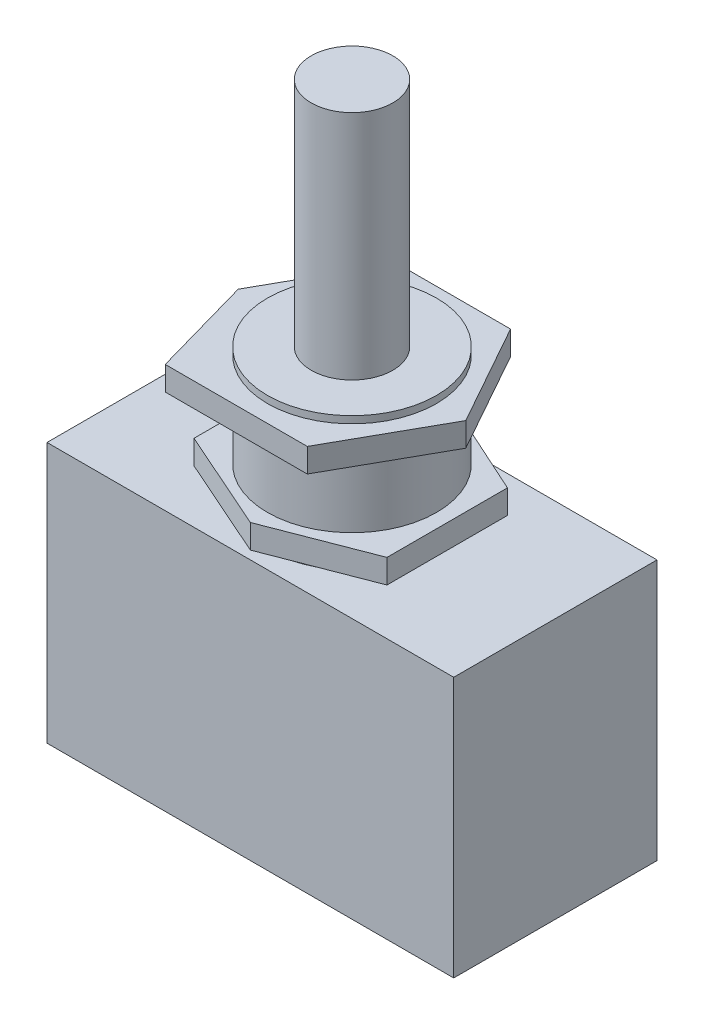
ISO-10303-21;
HEADER;
FILE_DESCRIPTION(('STEP AP214'),'2;1');
FILE_NAME('part.step','',(''),(''),'','','');
FILE_SCHEMA(('AUTOMOTIVE_DESIGN { 1 0 10303 214 1 1 1 1 }'));
ENDSEC;
DATA;
#1=APPLICATION_CONTEXT('core data for automotive mechanical design processes');
#2=APPLICATION_PROTOCOL_DEFINITION('international standard','automotive_design',2000,#1);
#3=PRODUCT_CONTEXT('',#1,'mechanical');
#4=PRODUCT('Part','Part','',(#3));
#5=PRODUCT_RELATED_PRODUCT_CATEGORY('part','',(#4));
#6=PRODUCT_DEFINITION_FORMATION('','',#4);
#7=PRODUCT_DEFINITION_CONTEXT('part definition',#1,'design');
#8=PRODUCT_DEFINITION('design','',#6,#7);
#9=PRODUCT_DEFINITION_SHAPE('','',#8);
#10=(LENGTH_UNIT() NAMED_UNIT(*) SI_UNIT(.MILLI.,.METRE.));
#11=(NAMED_UNIT(*) PLANE_ANGLE_UNIT() SI_UNIT($,.RADIAN.));
#12=(NAMED_UNIT(*) SI_UNIT($,.STERADIAN.) SOLID_ANGLE_UNIT());
#13=UNCERTAINTY_MEASURE_WITH_UNIT(LENGTH_MEASURE(1.E-05),#10,'distance_accuracy_value','');
#14=(GEOMETRIC_REPRESENTATION_CONTEXT(3) GLOBAL_UNCERTAINTY_ASSIGNED_CONTEXT((#13)) GLOBAL_UNIT_ASSIGNED_CONTEXT((#10,
#11,#12)) REPRESENTATION_CONTEXT('',''));
#15=CARTESIAN_POINT('',(0.,0.,0.));
#16=DIRECTION('',(0.,0.,1.));
#17=DIRECTION('',(1.,0.,0.));
#18=AXIS2_PLACEMENT_3D('',#15,#16,#17);
#19=CARTESIAN_POINT('',(0.,18.75,0.));
#20=DIRECTION('',(0.,-1.,0.));
#21=DIRECTION('',(0.,0.,-1.));
#22=AXIS2_PLACEMENT_3D('',#19,#20,#21);
#23=CYLINDRICAL_SURFACE('',#22,6.);
#24=CARTESIAN_POINT('',(0.,11.55,0.));
#25=DIRECTION('',(0.,1.,0.));
#26=DIRECTION('',(0.,0.,1.));
#27=AXIS2_PLACEMENT_3D('',#24,#25,#26);
#28=CIRCLE('',#27,6.);
#29=CARTESIAN_POINT('',(0.,11.55,6.));
#30=VERTEX_POINT('',#29);
#31=EDGE_CURVE('E409',#30,#30,#28,.T.);
#32=ORIENTED_EDGE('',*,*,#31,.T.);
#33=EDGE_LOOP('',(#32));
#34=FACE_BOUND('',#33,.T.);
#35=CARTESIAN_POINT('',(0.,16.55,0.));
#36=DIRECTION('',(0.,1.,0.));
#37=DIRECTION('',(0.,0.,1.));
#38=AXIS2_PLACEMENT_3D('',#35,#36,#37);
#39=CIRCLE('',#38,6.);
#40=CARTESIAN_POINT('',(0.,16.55,6.));
#41=VERTEX_POINT('',#40);
#42=EDGE_CURVE('E284',#41,#41,#39,.T.);
#43=ORIENTED_EDGE('',*,*,#42,.F.);
#44=EDGE_LOOP('',(#43));
#45=FACE_BOUND('',#44,.T.);
#46=ADVANCED_FACE('F45',(#34,#45),#23,.T.);
#47=CARTESIAN_POINT('',(0.,9.25,0.));
#48=DIRECTION('',(0.,1.,0.));
#49=DIRECTION('',(0.,0.,1.));
#50=AXIS2_PLACEMENT_3D('',#47,#48,#49);
#51=CIRCLE('',#50,6.);
#52=CARTESIAN_POINT('',(0.,9.25,6.));
#53=VERTEX_POINT('',#52);
#54=EDGE_CURVE('E415',#53,#53,#51,.T.);
#55=ORIENTED_EDGE('',*,*,#54,.T.);
#56=EDGE_LOOP('',(#55));
#57=FACE_BOUND('',#56,.T.);
#58=CARTESIAN_POINT('',(0.,9.85,0.));
#59=DIRECTION('',(0.,1.,0.));
#60=DIRECTION('',(0.,0.,1.));
#61=AXIS2_PLACEMENT_3D('',#58,#59,#60);
#62=CIRCLE('',#61,6.);
#63=CARTESIAN_POINT('',(0.,9.85,6.));
#64=VERTEX_POINT('',#63);
#65=EDGE_CURVE('E419',#64,#64,#62,.T.);
#66=ORIENTED_EDGE('',*,*,#65,.F.);
#67=EDGE_LOOP('',(#66));
#68=FACE_BOUND('',#67,.T.);
#69=ADVANCED_FACE('F511',(#57,#68),#23,.T.);
#70=CARTESIAN_POINT('',(14.445,-9.25,7.22));
#71=DIRECTION('',(-1.,0.,0.));
#72=DIRECTION('',(0.,0.,1.));
#73=AXIS2_PLACEMENT_3D('',#70,#71,#72);
#74=PLANE('',#73);
#75=DIRECTION('',(0.,1.,0.));
#76=VECTOR('',#75,1.);
#77=CARTESIAN_POINT('',(14.445,-9.25,-7.22));
#78=LINE('',#77,#76);
#79=CARTESIAN_POINT('',(14.445,-9.25,-7.22));
#80=VERTEX_POINT('',#79);
#81=CARTESIAN_POINT('',(14.445,9.25,-7.22));
#82=VERTEX_POINT('',#81);
#83=EDGE_CURVE('E414',#80,#82,#78,.T.);
#84=ORIENTED_EDGE('',*,*,#83,.T.);
#85=DIRECTION('',(0.,0.,-1.));
#86=VECTOR('',#85,1.);
#87=CARTESIAN_POINT('',(14.445,9.25,7.22));
#88=LINE('',#87,#86);
#89=CARTESIAN_POINT('',(14.445,9.25,7.22));
#90=VERTEX_POINT('',#89);
#91=EDGE_CURVE('E420',#90,#82,#88,.T.);
#92=ORIENTED_EDGE('',*,*,#91,.F.);
#93=DIRECTION('',(0.,1.,0.));
#94=VECTOR('',#93,1.);
#95=CARTESIAN_POINT('',(14.445,-9.25,7.22));
#96=LINE('',#95,#94);
#97=CARTESIAN_POINT('',(14.445,-9.25,7.22));
#98=VERTEX_POINT('',#97);
#99=EDGE_CURVE('E421',#98,#90,#96,.T.);
#100=ORIENTED_EDGE('',*,*,#99,.F.);
#101=DIRECTION('',(0.,0.,-1.));
#102=VECTOR('',#101,1.);
#103=CARTESIAN_POINT('',(14.445,-9.25,7.22));
#104=LINE('',#103,#102);
#105=EDGE_CURVE('E435',#98,#80,#104,.T.);
#106=ORIENTED_EDGE('',*,*,#105,.T.);
#107=EDGE_LOOP('',(#84,#92,#100,#106));
#108=FACE_BOUND('',#107,.T.);
#109=ADVANCED_FACE('F47',(#108),#74,.F.);
#110=CARTESIAN_POINT('',(-14.445,9.25,7.22));
#111=DIRECTION('',(0.,-1.,0.));
#112=DIRECTION('',(0.,0.,-1.));
#113=AXIS2_PLACEMENT_3D('',#110,#111,#112);
#114=PLANE('',#113);
#115=ORIENTED_EDGE('',*,*,#54,.F.);
#116=EDGE_LOOP('',(#115));
#117=FACE_BOUND('',#116,.T.);
#118=DIRECTION('',(-1.,0.,0.));
#119=VECTOR('',#118,1.);
#120=CARTESIAN_POINT('',(-14.445,9.25,-7.22));
#121=LINE('',#120,#119);
#122=CARTESIAN_POINT('',(-14.445,9.25,-7.22));
#123=VERTEX_POINT('',#122);
#124=EDGE_CURVE('E439',#82,#123,#121,.T.);
#125=ORIENTED_EDGE('',*,*,#124,.T.);
#126=DIRECTION('',(0.,0.,-1.));
#127=VECTOR('',#126,1.);
#128=CARTESIAN_POINT('',(-14.445,9.25,7.22));
#129=LINE('',#128,#127);
#130=CARTESIAN_POINT('',(-14.445,9.25,7.22));
#131=VERTEX_POINT('',#130);
#132=EDGE_CURVE('E454',#131,#123,#129,.T.);
#133=ORIENTED_EDGE('',*,*,#132,.F.);
#134=DIRECTION('',(-1.,0.,0.));
#135=VECTOR('',#134,1.);
#136=CARTESIAN_POINT('',(-14.445,9.25,7.22));
#137=LINE('',#136,#135);
#138=EDGE_CURVE('E425',#90,#131,#137,.T.);
#139=ORIENTED_EDGE('',*,*,#138,.F.);
#140=ORIENTED_EDGE('',*,*,#91,.T.);
#141=EDGE_LOOP('',(#125,#133,#139,#140));
#142=FACE_BOUND('',#141,.T.);
#143=ADVANCED_FACE('F658',(#117,#142),#114,.F.);
#144=CARTESIAN_POINT('',(-14.445,-9.25,7.22));
#145=DIRECTION('',(1.,0.,0.));
#146=DIRECTION('',(0.,0.,-1.));
#147=AXIS2_PLACEMENT_3D('',#144,#145,#146);
#148=PLANE('',#147);
#149=DIRECTION('',(0.,-1.,0.));
#150=VECTOR('',#149,1.);
#151=CARTESIAN_POINT('',(-14.445,-9.25,-7.22));
#152=LINE('',#151,#150);
#153=CARTESIAN_POINT('',(-14.445,-9.25,-7.22));
#154=VERTEX_POINT('',#153);
#155=EDGE_CURVE('E442',#123,#154,#152,.T.);
#156=ORIENTED_EDGE('',*,*,#155,.T.);
#157=DIRECTION('',(0.,0.,-1.));
#158=VECTOR('',#157,1.);
#159=CARTESIAN_POINT('',(-14.445,-9.25,7.22));
#160=LINE('',#159,#158);
#161=CARTESIAN_POINT('',(-14.445,-9.25,7.22));
#162=VERTEX_POINT('',#161);
#163=EDGE_CURVE('E450',#162,#154,#160,.T.);
#164=ORIENTED_EDGE('',*,*,#163,.F.);
#165=DIRECTION('',(0.,-1.,0.));
#166=VECTOR('',#165,1.);
#167=CARTESIAN_POINT('',(-14.445,-9.25,7.22));
#168=LINE('',#167,#166);
#169=EDGE_CURVE('E429',#131,#162,#168,.T.);
#170=ORIENTED_EDGE('',*,*,#169,.F.);
#171=ORIENTED_EDGE('',*,*,#132,.T.);
#172=EDGE_LOOP('',(#156,#164,#170,#171));
#173=FACE_BOUND('',#172,.T.);
#174=ADVANCED_FACE('F656',(#173),#148,.F.);
#175=CARTESIAN_POINT('',(-14.445,-9.25,7.22));
#176=DIRECTION('',(0.,1.,0.));
#177=DIRECTION('',(0.,0.,1.));
#178=AXIS2_PLACEMENT_3D('',#175,#176,#177);
#179=PLANE('',#178);
#180=DIRECTION('',(1.,0.,0.));
#181=VECTOR('',#180,1.);
#182=CARTESIAN_POINT('',(-14.445,-9.25,3.1));
#183=LINE('',#182,#181);
#184=CARTESIAN_POINT('',(-8.8,-9.25,3.1));
#185=VERTEX_POINT('',#184);
#186=CARTESIAN_POINT('',(-7.2,-9.25,3.1));
#187=VERTEX_POINT('',#186);
#188=EDGE_CURVE('E54',#185,#187,#183,.T.);
#189=ORIENTED_EDGE('',*,*,#188,.T.);
#190=DIRECTION('',(0.,0.,-1.));
#191=VECTOR('',#190,1.);
#192=CARTESIAN_POINT('',(-7.2,-9.25,7.22));
#193=LINE('',#192,#191);
#194=CARTESIAN_POINT('',(-7.2,-9.25,-3.1));
#195=VERTEX_POINT('',#194);
#196=EDGE_CURVE('E11',#187,#195,#193,.T.);
#197=ORIENTED_EDGE('',*,*,#196,.T.);
#198=DIRECTION('',(-1.,0.,0.));
#199=VECTOR('',#198,1.);
#200=CARTESIAN_POINT('',(-14.445,-9.25,-3.1));
#201=LINE('',#200,#199);
#202=CARTESIAN_POINT('',(-8.8,-9.25,-3.1));
#203=VERTEX_POINT('',#202);
#204=EDGE_CURVE('E210',#195,#203,#201,.T.);
#205=ORIENTED_EDGE('',*,*,#204,.T.);
#206=DIRECTION('',(0.,0.,1.));
#207=VECTOR('',#206,1.);
#208=CARTESIAN_POINT('',(-8.8,-9.25,7.22));
#209=LINE('',#208,#207);
#210=EDGE_CURVE('E490',#203,#185,#209,.T.);
#211=ORIENTED_EDGE('',*,*,#210,.T.);
#212=EDGE_LOOP('',(#189,#197,#205,#211));
#213=FACE_BOUND('',#212,.T.);
#214=DIRECTION('',(1.,0.,0.));
#215=VECTOR('',#214,1.);
#216=CARTESIAN_POINT('',(-14.445,-9.25,3.1));
#217=LINE('',#216,#215);
#218=CARTESIAN_POINT('',(7.2,-9.25,3.1));
#219=VERTEX_POINT('',#218);
#220=CARTESIAN_POINT('',(8.8,-9.25,3.1));
#221=VERTEX_POINT('',#220);
#222=EDGE_CURVE('E480',#219,#221,#217,.T.);
#223=ORIENTED_EDGE('',*,*,#222,.T.);
#224=DIRECTION('',(0.,0.,-1.));
#225=VECTOR('',#224,1.);
#226=CARTESIAN_POINT('',(8.8,-9.25,7.22));
#227=LINE('',#226,#225);
#228=CARTESIAN_POINT('',(8.8,-9.25,-3.1));
#229=VERTEX_POINT('',#228);
#230=EDGE_CURVE('E484',#221,#229,#227,.T.);
#231=ORIENTED_EDGE('',*,*,#230,.T.);
#232=DIRECTION('',(-1.,0.,0.));
#233=VECTOR('',#232,1.);
#234=CARTESIAN_POINT('',(-14.445,-9.25,-3.1));
#235=LINE('',#234,#233);
#236=CARTESIAN_POINT('',(7.2,-9.25,-3.1));
#237=VERTEX_POINT('',#236);
#238=EDGE_CURVE('E283',#229,#237,#235,.T.);
#239=ORIENTED_EDGE('',*,*,#238,.T.);
#240=DIRECTION('',(0.,0.,1.));
#241=VECTOR('',#240,1.);
#242=CARTESIAN_POINT('',(7.2,-9.25,7.22));
#243=LINE('',#242,#241);
#244=EDGE_CURVE('E476',#237,#219,#243,.T.);
#245=ORIENTED_EDGE('',*,*,#244,.T.);
#246=EDGE_LOOP('',(#223,#231,#239,#245));
#247=FACE_BOUND('',#246,.T.);
#248=DIRECTION('',(1.,0.,0.));
#249=VECTOR('',#248,1.);
#250=CARTESIAN_POINT('',(-14.445,-9.25,-7.22));
#251=LINE('',#250,#249);
#252=EDGE_CURVE('E426',#154,#80,#251,.T.);
#253=ORIENTED_EDGE('',*,*,#252,.T.);
#254=ORIENTED_EDGE('',*,*,#105,.F.);
#255=DIRECTION('',(1.,0.,0.));
#256=VECTOR('',#255,1.);
#257=CARTESIAN_POINT('',(-14.445,-9.25,7.22));
#258=LINE('',#257,#256);
#259=EDGE_CURVE('E432',#162,#98,#258,.T.);
#260=ORIENTED_EDGE('',*,*,#259,.F.);
#261=ORIENTED_EDGE('',*,*,#163,.T.);
#262=EDGE_LOOP('',(#253,#254,#260,#261));
#263=FACE_BOUND('',#262,.T.);
#264=ADVANCED_FACE('F496',(#213,#247,#263),#179,.F.);
#265=CARTESIAN_POINT('',(0.,0.,7.22));
#266=DIRECTION('',(0.,0.,-1.));
#267=DIRECTION('',(-1.,0.,0.));
#268=AXIS2_PLACEMENT_3D('',#265,#266,#267);
#269=PLANE('',#268);
#270=ORIENTED_EDGE('',*,*,#99,.T.);
#271=ORIENTED_EDGE('',*,*,#138,.T.);
#272=ORIENTED_EDGE('',*,*,#169,.T.);
#273=ORIENTED_EDGE('',*,*,#259,.T.);
#274=EDGE_LOOP('',(#270,#271,#272,#273));
#275=FACE_BOUND('',#274,.T.);
#276=ADVANCED_FACE('F626',(#275),#269,.F.);
#277=CARTESIAN_POINT('',(0.,0.,-7.22));
#278=DIRECTION('',(0.,0.,-1.));
#279=DIRECTION('',(-1.,0.,0.));
#280=AXIS2_PLACEMENT_3D('',#277,#278,#279);
#281=PLANE('',#280);
#282=ORIENTED_EDGE('',*,*,#83,.F.);
#283=ORIENTED_EDGE('',*,*,#252,.F.);
#284=ORIENTED_EDGE('',*,*,#155,.F.);
#285=ORIENTED_EDGE('',*,*,#124,.F.);
#286=EDGE_LOOP('',(#282,#283,#284,#285));
#287=FACE_BOUND('',#286,.T.);
#288=ADVANCED_FACE('F621',(#287),#281,.T.);
#289=CARTESIAN_POINT('',(7.,11.55,4.51543450408666));
#290=DIRECTION('',(-1.,0.,0.));
#291=DIRECTION('',(0.,0.,1.));
#292=AXIS2_PLACEMENT_3D('',#289,#290,#291);
#293=PLANE('',#292);
#294=DIRECTION('',(0.,0.,-1.));
#295=VECTOR('',#294,1.);
#296=CARTESIAN_POINT('',(7.,9.85,4.51543450408666));
#297=LINE('',#296,#295);
#298=CARTESIAN_POINT('',(7.,9.85,4.51543450408666));
#299=VERTEX_POINT('',#298);
#300=CARTESIAN_POINT('',(7.,9.85,-4.0415));
#301=VERTEX_POINT('',#300);
#302=EDGE_CURVE('E368',#299,#301,#297,.T.);
#303=ORIENTED_EDGE('',*,*,#302,.T.);
#304=DIRECTION('',(0.,-1.,0.));
#305=VECTOR('',#304,1.);
#306=CARTESIAN_POINT('',(7.,11.55,-4.0415));
#307=LINE('',#306,#305);
#308=CARTESIAN_POINT('',(7.,11.55,-4.0415));
#309=VERTEX_POINT('',#308);
#310=EDGE_CURVE('E405',#309,#301,#307,.T.);
#311=ORIENTED_EDGE('',*,*,#310,.F.);
#312=DIRECTION('',(0.,0.,-1.));
#313=VECTOR('',#312,1.);
#314=CARTESIAN_POINT('',(7.,11.55,4.51543450408666));
#315=LINE('',#314,#313);
#316=CARTESIAN_POINT('',(7.,11.55,4.51543450408666));
#317=VERTEX_POINT('',#316);
#318=EDGE_CURVE('E347',#317,#309,#315,.T.);
#319=ORIENTED_EDGE('',*,*,#318,.F.);
#320=DIRECTION('',(0.,-1.,0.));
#321=VECTOR('',#320,1.);
#322=CARTESIAN_POINT('',(7.,11.55,4.51543450408666));
#323=LINE('',#322,#321);
#324=EDGE_CURVE('E367',#317,#299,#323,.T.);
#325=ORIENTED_EDGE('',*,*,#324,.T.);
#326=EDGE_LOOP('',(#303,#311,#319,#325));
#327=FACE_BOUND('',#326,.T.);
#328=ADVANCED_FACE('F618',(#327),#293,.F.);
#329=CARTESIAN_POINT('',(7.,11.55,-4.0415));
#330=DIRECTION('',(-0.413445204535206,0.,0.910529001650602));
#331=DIRECTION('',(0.910529001650602,0.,0.413445204535206));
#332=AXIS2_PLACEMENT_3D('',#329,#330,#331);
#333=PLANE('',#332);
#334=DIRECTION('',(-0.910529001650602,0.,-0.413445204535206));
#335=VECTOR('',#334,1.);
#336=CARTESIAN_POINT('',(7.,9.85,-4.0415));
#337=LINE('',#336,#335);
#338=CARTESIAN_POINT('',(0.,9.85,-7.22));
#339=VERTEX_POINT('',#338);
#340=EDGE_CURVE('E372',#301,#339,#337,.T.);
#341=ORIENTED_EDGE('',*,*,#340,.T.);
#342=DIRECTION('',(0.,-1.,0.));
#343=VECTOR('',#342,1.);
#344=CARTESIAN_POINT('',(0.,11.55,-7.22));
#345=LINE('',#344,#343);
#346=CARTESIAN_POINT('',(0.,11.55,-7.22));
#347=VERTEX_POINT('',#346);
#348=EDGE_CURVE('E401',#347,#339,#345,.T.);
#349=ORIENTED_EDGE('',*,*,#348,.F.);
#350=DIRECTION('',(-0.910529001650602,0.,-0.413445204535206));
#351=VECTOR('',#350,1.);
#352=CARTESIAN_POINT('',(7.,11.55,-4.0415));
#353=LINE('',#352,#351);
#354=EDGE_CURVE('E351',#309,#347,#353,.T.);
#355=ORIENTED_EDGE('',*,*,#354,.F.);
#356=ORIENTED_EDGE('',*,*,#310,.T.);
#357=EDGE_LOOP('',(#341,#349,#355,#356));
#358=FACE_BOUND('',#357,.T.);
#359=ADVANCED_FACE('F614',(#358),#333,.F.);
#360=CARTESIAN_POINT('',(0.,11.55,-7.22));
#361=DIRECTION('',(0.351491323758256,0.,0.93619113931006));
#362=DIRECTION('',(0.93619113931006,0.,-0.351491323758256));
#363=AXIS2_PLACEMENT_3D('',#360,#361,#362);
#364=PLANE('',#363);
#365=DIRECTION('',(-0.93619113931006,0.,0.351491323758256));
#366=VECTOR('',#365,1.);
#367=CARTESIAN_POINT('',(0.,9.85,-7.22));
#368=LINE('',#367,#366);
#369=CARTESIAN_POINT('',(-7.18110389051737,9.85,-4.5238671201442));
#370=VERTEX_POINT('',#369);
#371=EDGE_CURVE('E375',#339,#370,#368,.T.);
#372=ORIENTED_EDGE('',*,*,#371,.T.);
#373=DIRECTION('',(0.,-1.,0.));
#374=VECTOR('',#373,1.);
#375=CARTESIAN_POINT('',(-7.18110389051737,11.55,-4.5238671201442));
#376=LINE('',#375,#374);
#377=CARTESIAN_POINT('',(-7.18110389051737,11.55,-4.5238671201442));
#378=VERTEX_POINT('',#377);
#379=EDGE_CURVE('E397',#378,#370,#376,.T.);
#380=ORIENTED_EDGE('',*,*,#379,.F.);
#381=DIRECTION('',(-0.93619113931006,0.,0.351491323758256));
#382=VECTOR('',#381,1.);
#383=CARTESIAN_POINT('',(0.,11.55,-7.22));
#384=LINE('',#383,#382);
#385=EDGE_CURVE('E355',#347,#378,#384,.T.);
#386=ORIENTED_EDGE('',*,*,#385,.F.);
#387=ORIENTED_EDGE('',*,*,#348,.T.);
#388=EDGE_LOOP('',(#372,#380,#386,#387));
#389=FACE_BOUND('',#388,.T.);
#390=ADVANCED_FACE('F610',(#389),#364,.F.);
#391=CARTESIAN_POINT('',(-7.18110389051737,11.55,-4.5238671201442));
#392=DIRECTION('',(1.,0.,0.));
#393=DIRECTION('',(0.,0.,-1.));
#394=AXIS2_PLACEMENT_3D('',#391,#392,#393);
#395=PLANE('',#394);
#396=DIRECTION('',(0.,0.,1.));
#397=VECTOR('',#396,1.);
#398=CARTESIAN_POINT('',(-7.18110389051737,9.85,-4.5238671201442));
#399=LINE('',#398,#397);
#400=CARTESIAN_POINT('',(-7.18110389051737,9.85,4.0415));
#401=VERTEX_POINT('',#400);
#402=EDGE_CURVE('E378',#370,#401,#399,.T.);
#403=ORIENTED_EDGE('',*,*,#402,.T.);
#404=DIRECTION('',(0.,-1.,0.));
#405=VECTOR('',#404,1.);
#406=CARTESIAN_POINT('',(-7.18110389051737,11.55,4.0415));
#407=LINE('',#406,#405);
#408=CARTESIAN_POINT('',(-7.18110389051737,11.55,4.0415));
#409=VERTEX_POINT('',#408);
#410=EDGE_CURVE('E393',#409,#401,#407,.T.);
#411=ORIENTED_EDGE('',*,*,#410,.F.);
#412=DIRECTION('',(0.,0.,1.));
#413=VECTOR('',#412,1.);
#414=CARTESIAN_POINT('',(-7.18110389051737,11.55,-4.5238671201442));
#415=LINE('',#414,#413);
#416=EDGE_CURVE('E358',#378,#409,#415,.T.);
#417=ORIENTED_EDGE('',*,*,#416,.F.);
#418=ORIENTED_EDGE('',*,*,#379,.T.);
#419=EDGE_LOOP('',(#403,#411,#417,#418));
#420=FACE_BOUND('',#419,.T.);
#421=ADVANCED_FACE('F606',(#420),#395,.F.);
#422=CARTESIAN_POINT('',(-7.18110389051737,11.55,4.0415));
#423=DIRECTION('',(0.40474483405469,0.,-0.914429668868001));
#424=DIRECTION('',(-0.914429668868001,0.,-0.40474483405469));
#425=AXIS2_PLACEMENT_3D('',#422,#423,#424);
#426=PLANE('',#425);
#427=DIRECTION('',(0.914429668868001,0.,0.40474483405469));
#428=VECTOR('',#427,1.);
#429=CARTESIAN_POINT('',(-7.18110389051737,9.85,4.0415));
#430=LINE('',#429,#428);
#431=CARTESIAN_POINT('',(0.,9.85,7.22));
#432=VERTEX_POINT('',#431);
#433=EDGE_CURVE('E381',#401,#432,#430,.T.);
#434=ORIENTED_EDGE('',*,*,#433,.T.);
#435=DIRECTION('',(0.,-1.,0.));
#436=VECTOR('',#435,1.);
#437=CARTESIAN_POINT('',(0.,11.55,7.22));
#438=LINE('',#437,#436);
#439=CARTESIAN_POINT('',(0.,11.55,7.22));
#440=VERTEX_POINT('',#439);
#441=EDGE_CURVE('E389',#440,#432,#438,.T.);
#442=ORIENTED_EDGE('',*,*,#441,.F.);
#443=DIRECTION('',(0.914429668868001,0.,0.40474483405469));
#444=VECTOR('',#443,1.);
#445=CARTESIAN_POINT('',(-7.18110389051737,11.55,4.0415));
#446=LINE('',#445,#444);
#447=EDGE_CURVE('E361',#409,#440,#446,.T.);
#448=ORIENTED_EDGE('',*,*,#447,.F.);
#449=ORIENTED_EDGE('',*,*,#410,.T.);
#450=EDGE_LOOP('',(#434,#442,#448,#449));
#451=FACE_BOUND('',#450,.T.);
#452=ADVANCED_FACE('F602',(#451),#426,.F.);
#453=CARTESIAN_POINT('',(0.,11.55,7.22));
#454=DIRECTION('',(-0.360401602964452,0.,-0.932797236585022));
#455=DIRECTION('',(-0.932797236585022,0.,0.360401602964452));
#456=AXIS2_PLACEMENT_3D('',#453,#454,#455);
#457=PLANE('',#456);
#458=DIRECTION('',(0.932797236585022,0.,-0.360401602964452));
#459=VECTOR('',#458,1.);
#460=CARTESIAN_POINT('',(0.,9.85,7.22));
#461=LINE('',#460,#459);
#462=EDGE_CURVE('E352',#432,#299,#461,.T.);
#463=ORIENTED_EDGE('',*,*,#462,.T.);
#464=ORIENTED_EDGE('',*,*,#324,.F.);
#465=DIRECTION('',(0.932797236585022,0.,-0.360401602964452));
#466=VECTOR('',#465,1.);
#467=CARTESIAN_POINT('',(0.,11.55,7.22));
#468=LINE('',#467,#466);
#469=EDGE_CURVE('E364',#440,#317,#468,.T.);
#470=ORIENTED_EDGE('',*,*,#469,.F.);
#471=ORIENTED_EDGE('',*,*,#441,.T.);
#472=EDGE_LOOP('',(#463,#464,#470,#471));
#473=FACE_BOUND('',#472,.T.);
#474=ADVANCED_FACE('F596',(#473),#457,.F.);
#475=CARTESIAN_POINT('',(0.,11.55,0.));
#476=DIRECTION('',(0.,1.,0.));
#477=DIRECTION('',(0.,0.,1.));
#478=AXIS2_PLACEMENT_3D('',#475,#476,#477);
#479=PLANE('',#478);
#480=ORIENTED_EDGE('',*,*,#31,.F.);
#481=EDGE_LOOP('',(#480));
#482=FACE_BOUND('',#481,.T.);
#483=ORIENTED_EDGE('',*,*,#318,.T.);
#484=ORIENTED_EDGE('',*,*,#354,.T.);
#485=ORIENTED_EDGE('',*,*,#385,.T.);
#486=ORIENTED_EDGE('',*,*,#416,.T.);
#487=ORIENTED_EDGE('',*,*,#447,.T.);
#488=ORIENTED_EDGE('',*,*,#469,.T.);
#489=EDGE_LOOP('',(#483,#484,#485,#486,#487,#488));
#490=FACE_BOUND('',#489,.T.);
#491=ADVANCED_FACE('F593',(#482,#490),#479,.T.);
#492=CARTESIAN_POINT('',(0.,9.85,0.));
#493=DIRECTION('',(0.,1.,0.));
#494=DIRECTION('',(0.,0.,1.));
#495=AXIS2_PLACEMENT_3D('',#492,#493,#494);
#496=PLANE('',#495);
#497=ORIENTED_EDGE('',*,*,#65,.T.);
#498=EDGE_LOOP('',(#497));
#499=FACE_BOUND('',#498,.T.);
#500=ORIENTED_EDGE('',*,*,#302,.F.);
#501=ORIENTED_EDGE('',*,*,#462,.F.);
#502=ORIENTED_EDGE('',*,*,#433,.F.);
#503=ORIENTED_EDGE('',*,*,#402,.F.);
#504=ORIENTED_EDGE('',*,*,#371,.F.);
#505=ORIENTED_EDGE('',*,*,#340,.F.);
#506=EDGE_LOOP('',(#500,#501,#502,#503,#504,#505));
#507=FACE_BOUND('',#506,.T.);
#508=ADVANCED_FACE('F592',(#499,#507),#496,.F.);
#509=CARTESIAN_POINT('',(4.0415,18.25,7.22));
#510=DIRECTION('',(-0.872593590741303,0.,-0.48844695249044));
#511=DIRECTION('',(-0.48844695249044,0.,0.872593590741304));
#512=AXIS2_PLACEMENT_3D('',#509,#510,#511);
#513=PLANE('',#512);
#514=DIRECTION('',(0.48844695249044,0.,-0.872593590741303));
#515=VECTOR('',#514,1.);
#516=CARTESIAN_POINT('',(4.0415,16.55,7.22));
#517=LINE('',#516,#515);
#518=CARTESIAN_POINT('',(4.0415,16.55,7.22));
#519=VERTEX_POINT('',#518);
#520=CARTESIAN_POINT('',(8.083,16.55,0.));
#521=VERTEX_POINT('',#520);
#522=EDGE_CURVE('E278',#519,#521,#517,.T.);
#523=ORIENTED_EDGE('',*,*,#522,.T.);
#524=DIRECTION('',(0.,-1.,0.));
#525=VECTOR('',#524,1.);
#526=CARTESIAN_POINT('',(8.083,18.25,0.));
#527=LINE('',#526,#525);
#528=CARTESIAN_POINT('',(8.083,18.25,0.));
#529=VERTEX_POINT('',#528);
#530=EDGE_CURVE('E342',#529,#521,#527,.T.);
#531=ORIENTED_EDGE('',*,*,#530,.F.);
#532=DIRECTION('',(0.48844695249044,0.,-0.872593590741303));
#533=VECTOR('',#532,1.);
#534=CARTESIAN_POINT('',(4.0415,18.25,7.22));
#535=LINE('',#534,#533);
#536=CARTESIAN_POINT('',(4.0415,18.25,7.22));
#537=VERTEX_POINT('',#536);
#538=EDGE_CURVE('E285',#537,#529,#535,.T.);
#539=ORIENTED_EDGE('',*,*,#538,.F.);
#540=DIRECTION('',(0.,-1.,0.));
#541=VECTOR('',#540,1.);
#542=CARTESIAN_POINT('',(4.0415,18.25,7.22));
#543=LINE('',#542,#541);
#544=EDGE_CURVE('E305',#537,#519,#543,.T.);
#545=ORIENTED_EDGE('',*,*,#544,.T.);
#546=EDGE_LOOP('',(#523,#531,#539,#545));
#547=FACE_BOUND('',#546,.T.);
#548=ADVANCED_FACE('F554',(#547),#513,.F.);
#549=CARTESIAN_POINT('',(8.083,18.25,0.));
#550=DIRECTION('',(-0.872593590741303,0.,0.48844695249044));
#551=DIRECTION('',(0.48844695249044,0.,0.872593590741304));
#552=AXIS2_PLACEMENT_3D('',#549,#550,#551);
#553=PLANE('',#552);
#554=DIRECTION('',(-0.48844695249044,0.,-0.872593590741303));
#555=VECTOR('',#554,1.);
#556=CARTESIAN_POINT('',(8.083,16.55,0.));
#557=LINE('',#556,#555);
#558=CARTESIAN_POINT('',(4.0415,16.55,-7.22));
#559=VERTEX_POINT('',#558);
#560=EDGE_CURVE('E309',#521,#559,#557,.T.);
#561=ORIENTED_EDGE('',*,*,#560,.T.);
#562=DIRECTION('',(0.,-1.,0.));
#563=VECTOR('',#562,1.);
#564=CARTESIAN_POINT('',(4.0415,18.25,-7.22));
#565=LINE('',#564,#563);
#566=CARTESIAN_POINT('',(4.0415,18.25,-7.22));
#567=VERTEX_POINT('',#566);
#568=EDGE_CURVE('E338',#567,#559,#565,.T.);
#569=ORIENTED_EDGE('',*,*,#568,.F.);
#570=DIRECTION('',(-0.48844695249044,0.,-0.872593590741303));
#571=VECTOR('',#570,1.);
#572=CARTESIAN_POINT('',(8.083,18.25,0.));
#573=LINE('',#572,#571);
#574=EDGE_CURVE('E289',#529,#567,#573,.T.);
#575=ORIENTED_EDGE('',*,*,#574,.F.);
#576=ORIENTED_EDGE('',*,*,#530,.T.);
#577=EDGE_LOOP('',(#561,#569,#575,#576));
#578=FACE_BOUND('',#577,.T.);
#579=ADVANCED_FACE('F557',(#578),#553,.F.);
#580=CARTESIAN_POINT('',(4.0415,18.25,-7.22));
#581=DIRECTION('',(0.,0.,1.));
#582=DIRECTION('',(1.,0.,0.));
#583=AXIS2_PLACEMENT_3D('',#580,#581,#582);
#584=PLANE('',#583);
#585=DIRECTION('',(-1.,0.,0.));
#586=VECTOR('',#585,1.);
#587=CARTESIAN_POINT('',(4.0415,16.55,-7.22));
#588=LINE('',#587,#586);
#589=CARTESIAN_POINT('',(-4.0415,16.55,-7.22));
#590=VERTEX_POINT('',#589);
#591=EDGE_CURVE('E312',#559,#590,#588,.T.);
#592=ORIENTED_EDGE('',*,*,#591,.T.);
#593=DIRECTION('',(0.,-1.,0.));
#594=VECTOR('',#593,1.);
#595=CARTESIAN_POINT('',(-4.0415,18.25,-7.22));
#596=LINE('',#595,#594);
#597=CARTESIAN_POINT('',(-4.0415,18.25,-7.22));
#598=VERTEX_POINT('',#597);
#599=EDGE_CURVE('E334',#598,#590,#596,.T.);
#600=ORIENTED_EDGE('',*,*,#599,.F.);
#601=DIRECTION('',(-1.,0.,0.));
#602=VECTOR('',#601,1.);
#603=CARTESIAN_POINT('',(4.0415,18.25,-7.22));
#604=LINE('',#603,#602);
#605=EDGE_CURVE('E293',#567,#598,#604,.T.);
#606=ORIENTED_EDGE('',*,*,#605,.F.);
#607=ORIENTED_EDGE('',*,*,#568,.T.);
#608=EDGE_LOOP('',(#592,#600,#606,#607));
#609=FACE_BOUND('',#608,.T.);
#610=ADVANCED_FACE('F562',(#609),#584,.F.);
#611=CARTESIAN_POINT('',(-4.0415,18.25,-7.22));
#612=DIRECTION('',(0.872593590741303,0.,0.48844695249044));
#613=DIRECTION('',(0.48844695249044,0.,-0.872593590741304));
#614=AXIS2_PLACEMENT_3D('',#611,#612,#613);
#615=PLANE('',#614);
#616=DIRECTION('',(-0.48844695249044,0.,0.872593590741303));
#617=VECTOR('',#616,1.);
#618=CARTESIAN_POINT('',(-4.0415,16.55,-7.22));
#619=LINE('',#618,#617);
#620=CARTESIAN_POINT('',(-8.083,16.55,0.));
#621=VERTEX_POINT('',#620);
#622=EDGE_CURVE('E315',#590,#621,#619,.T.);
#623=ORIENTED_EDGE('',*,*,#622,.T.);
#624=DIRECTION('',(0.,-1.,0.));
#625=VECTOR('',#624,1.);
#626=CARTESIAN_POINT('',(-8.083,18.25,0.));
#627=LINE('',#626,#625);
#628=CARTESIAN_POINT('',(-8.083,18.25,0.));
#629=VERTEX_POINT('',#628);
#630=EDGE_CURVE('E330',#629,#621,#627,.T.);
#631=ORIENTED_EDGE('',*,*,#630,.F.);
#632=DIRECTION('',(-0.48844695249044,0.,0.872593590741303));
#633=VECTOR('',#632,1.);
#634=CARTESIAN_POINT('',(-4.0415,18.25,-7.22));
#635=LINE('',#634,#633);
#636=EDGE_CURVE('E296',#598,#629,#635,.T.);
#637=ORIENTED_EDGE('',*,*,#636,.F.);
#638=ORIENTED_EDGE('',*,*,#599,.T.);
#639=EDGE_LOOP('',(#623,#631,#637,#638));
#640=FACE_BOUND('',#639,.T.);
#641=ADVANCED_FACE('F568',(#640),#615,.F.);
#642=CARTESIAN_POINT('',(-8.083,18.25,0.));
#643=DIRECTION('',(0.962400997588984,0.,-0.271632692877216));
#644=DIRECTION('',(-0.271632692877216,0.,-0.962400997588984));
#645=AXIS2_PLACEMENT_3D('',#642,#643,#644);
#646=PLANE('',#645);
#647=DIRECTION('',(0.271632692877216,0.,0.962400997588984));
#648=VECTOR('',#647,1.);
#649=CARTESIAN_POINT('',(-8.083,16.55,0.));
#650=LINE('',#649,#648);
#651=CARTESIAN_POINT('',(-6.04519242552046,16.55,7.22));
#652=VERTEX_POINT('',#651);
#653=EDGE_CURVE('E318',#621,#652,#650,.T.);
#654=ORIENTED_EDGE('',*,*,#653,.T.);
#655=DIRECTION('',(0.,-1.,0.));
#656=VECTOR('',#655,1.);
#657=CARTESIAN_POINT('',(-6.04519242552046,18.25,7.22));
#658=LINE('',#657,#656);
#659=CARTESIAN_POINT('',(-6.04519242552046,18.25,7.22));
#660=VERTEX_POINT('',#659);
#661=EDGE_CURVE('E326',#660,#652,#658,.T.);
#662=ORIENTED_EDGE('',*,*,#661,.F.);
#663=DIRECTION('',(0.271632692877216,0.,0.962400997588984));
#664=VECTOR('',#663,1.);
#665=CARTESIAN_POINT('',(-8.083,18.25,0.));
#666=LINE('',#665,#664);
#667=EDGE_CURVE('E299',#629,#660,#666,.T.);
#668=ORIENTED_EDGE('',*,*,#667,.F.);
#669=ORIENTED_EDGE('',*,*,#630,.T.);
#670=EDGE_LOOP('',(#654,#662,#668,#669));
#671=FACE_BOUND('',#670,.T.);
#672=ADVANCED_FACE('F572',(#671),#646,.F.);
#673=CARTESIAN_POINT('',(-6.04519242552046,18.25,7.22));
#674=DIRECTION('',(0.,0.,-1.));
#675=DIRECTION('',(-1.,0.,0.));
#676=AXIS2_PLACEMENT_3D('',#673,#674,#675);
#677=PLANE('',#676);
#678=DIRECTION('',(1.,0.,0.));
#679=VECTOR('',#678,1.);
#680=CARTESIAN_POINT('',(-6.04519242552046,16.55,7.22));
#681=LINE('',#680,#679);
#682=EDGE_CURVE('E290',#652,#519,#681,.T.);
#683=ORIENTED_EDGE('',*,*,#682,.T.);
#684=ORIENTED_EDGE('',*,*,#544,.F.);
#685=DIRECTION('',(1.,0.,0.));
#686=VECTOR('',#685,1.);
#687=CARTESIAN_POINT('',(-6.04519242552046,18.25,7.22));
#688=LINE('',#687,#686);
#689=EDGE_CURVE('E302',#660,#537,#688,.T.);
#690=ORIENTED_EDGE('',*,*,#689,.F.);
#691=ORIENTED_EDGE('',*,*,#661,.T.);
#692=EDGE_LOOP('',(#683,#684,#690,#691));
#693=FACE_BOUND('',#692,.T.);
#694=ADVANCED_FACE('F546',(#693),#677,.F.);
#695=CARTESIAN_POINT('',(0.,18.25,0.));
#696=DIRECTION('',(0.,1.,0.));
#697=DIRECTION('',(0.,0.,1.));
#698=AXIS2_PLACEMENT_3D('',#695,#696,#697);
#699=PLANE('',#698);
#700=CARTESIAN_POINT('',(0.,18.25,0.));
#701=DIRECTION('',(0.,1.,0.));
#702=DIRECTION('',(0.,0.,1.));
#703=AXIS2_PLACEMENT_3D('',#700,#701,#702);
#704=CIRCLE('',#703,6.);
#705=CARTESIAN_POINT('',(0.,18.25,6.));
#706=VERTEX_POINT('',#705);
#707=EDGE_CURVE('E346',#706,#706,#704,.T.);
#708=ORIENTED_EDGE('',*,*,#707,.F.);
#709=EDGE_LOOP('',(#708));
#710=FACE_BOUND('',#709,.T.);
#711=ORIENTED_EDGE('',*,*,#538,.T.);
#712=ORIENTED_EDGE('',*,*,#574,.T.);
#713=ORIENTED_EDGE('',*,*,#605,.T.);
#714=ORIENTED_EDGE('',*,*,#636,.T.);
#715=ORIENTED_EDGE('',*,*,#667,.T.);
#716=ORIENTED_EDGE('',*,*,#689,.T.);
#717=EDGE_LOOP('',(#711,#712,#713,#714,#715,#716));
#718=FACE_BOUND('',#717,.T.);
#719=ADVANCED_FACE('F543',(#710,#718),#699,.T.);
#720=CARTESIAN_POINT('',(0.,16.55,0.));
#721=DIRECTION('',(0.,1.,0.));
#722=DIRECTION('',(0.,0.,1.));
#723=AXIS2_PLACEMENT_3D('',#720,#721,#722);
#724=PLANE('',#723);
#725=ORIENTED_EDGE('',*,*,#42,.T.);
#726=EDGE_LOOP('',(#725));
#727=FACE_BOUND('',#726,.T.);
#728=ORIENTED_EDGE('',*,*,#522,.F.);
#729=ORIENTED_EDGE('',*,*,#682,.F.);
#730=ORIENTED_EDGE('',*,*,#653,.F.);
#731=ORIENTED_EDGE('',*,*,#622,.F.);
#732=ORIENTED_EDGE('',*,*,#591,.F.);
#733=ORIENTED_EDGE('',*,*,#560,.F.);
#734=EDGE_LOOP('',(#728,#729,#730,#731,#732,#733));
#735=FACE_BOUND('',#734,.T.);
#736=ADVANCED_FACE('F536',(#727,#735),#724,.F.);
#737=CARTESIAN_POINT('',(0.,18.75,0.));
#738=DIRECTION('',(0.,1.,0.));
#739=DIRECTION('',(0.,0.,1.));
#740=AXIS2_PLACEMENT_3D('',#737,#738,#739);
#741=PLANE('',#740);
#742=CARTESIAN_POINT('',(0.,18.75,0.));
#743=DIRECTION('',(0.,1.,0.));
#744=DIRECTION('',(0.,0.,1.));
#745=AXIS2_PLACEMENT_3D('',#742,#743,#744);
#746=CIRCLE('',#745,2.9);
#747=CARTESIAN_POINT('',(0.,18.75,2.9));
#748=VERTEX_POINT('',#747);
#749=EDGE_CURVE('E279',#748,#748,#746,.T.);
#750=ORIENTED_EDGE('',*,*,#749,.F.);
#751=EDGE_LOOP('',(#750));
#752=FACE_BOUND('',#751,.T.);
#753=CARTESIAN_POINT('',(0.,18.75,0.));
#754=DIRECTION('',(0.,1.,0.));
#755=DIRECTION('',(0.,0.,1.));
#756=AXIS2_PLACEMENT_3D('',#753,#754,#755);
#757=CIRCLE('',#756,6.);
#758=CARTESIAN_POINT('',(0.,18.75,6.));
#759=VERTEX_POINT('',#758);
#760=EDGE_CURVE('E410',#759,#759,#757,.T.);
#761=ORIENTED_EDGE('',*,*,#760,.T.);
#762=EDGE_LOOP('',(#761));
#763=FACE_BOUND('',#762,.T.);
#764=ADVANCED_FACE('F526',(#752,#763),#741,.T.);
#765=ORIENTED_EDGE('',*,*,#707,.T.);
#766=EDGE_LOOP('',(#765));
#767=FACE_BOUND('',#766,.T.);
#768=ORIENTED_EDGE('',*,*,#760,.F.);
#769=EDGE_LOOP('',(#768));
#770=FACE_BOUND('',#769,.T.);
#771=ADVANCED_FACE('F514',(#767,#770),#23,.T.);
#772=CARTESIAN_POINT('',(0.,35.2,0.));
#773=DIRECTION('',(0.,-1.,0.));
#774=DIRECTION('',(0.,0.,-1.));
#775=AXIS2_PLACEMENT_3D('',#772,#773,#774);
#776=CYLINDRICAL_SURFACE('',#775,2.9);
#777=CARTESIAN_POINT('',(0.,35.2,0.));
#778=DIRECTION('',(0.,1.,0.));
#779=DIRECTION('',(0.,0.,1.));
#780=AXIS2_PLACEMENT_3D('',#777,#778,#779);
#781=CIRCLE('',#780,2.9);
#782=CARTESIAN_POINT('',(0.,35.2,2.9));
#783=VERTEX_POINT('',#782);
#784=EDGE_CURVE('E244',#783,#783,#781,.T.);
#785=ORIENTED_EDGE('',*,*,#784,.F.);
#786=EDGE_LOOP('',(#785));
#787=FACE_BOUND('',#786,.T.);
#788=ORIENTED_EDGE('',*,*,#749,.T.);
#789=EDGE_LOOP('',(#788));
#790=FACE_BOUND('',#789,.T.);
#791=ADVANCED_FACE('F525',(#787,#790),#776,.T.);
#792=CARTESIAN_POINT('',(0.,35.2,0.));
#793=DIRECTION('',(0.,1.,0.));
#794=DIRECTION('',(0.,0.,1.));
#795=AXIS2_PLACEMENT_3D('',#792,#793,#794);
#796=PLANE('',#795);
#797=ORIENTED_EDGE('',*,*,#784,.T.);
#798=EDGE_LOOP('',(#797));
#799=FACE_BOUND('',#798,.T.);
#800=ADVANCED_FACE('F533',(#799),#796,.T.);
#801=CARTESIAN_POINT('',(8.8,-10.5,3.1));
#802=DIRECTION('',(1.,0.,0.));
#803=DIRECTION('',(0.,0.,-1.));
#804=AXIS2_PLACEMENT_3D('',#801,#802,#803);
#805=PLANE('',#804);
#806=ORIENTED_EDGE('',*,*,#230,.F.);
#807=DIRECTION('',(0.,1.,0.));
#808=VECTOR('',#807,1.);
#809=CARTESIAN_POINT('',(8.8,-10.5,3.1));
#810=LINE('',#809,#808);
#811=CARTESIAN_POINT('',(8.8,-10.5,3.1));
#812=VERTEX_POINT('',#811);
#813=EDGE_CURVE('E262',#812,#221,#810,.T.);
#814=ORIENTED_EDGE('',*,*,#813,.F.);
#815=DIRECTION('',(0.,0.,-1.));
#816=VECTOR('',#815,1.);
#817=CARTESIAN_POINT('',(8.8,-10.5,3.1));
#818=LINE('',#817,#816);
#819=CARTESIAN_POINT('',(8.8,-10.5,-3.1));
#820=VERTEX_POINT('',#819);
#821=EDGE_CURVE('E231',#812,#820,#818,.T.);
#822=ORIENTED_EDGE('',*,*,#821,.T.);
#823=DIRECTION('',(0.,1.,0.));
#824=VECTOR('',#823,1.);
#825=CARTESIAN_POINT('',(8.8,-10.5,-3.1));
#826=LINE('',#825,#824);
#827=EDGE_CURVE('E251',#820,#229,#826,.T.);
#828=ORIENTED_EDGE('',*,*,#827,.T.);
#829=EDGE_LOOP('',(#806,#814,#822,#828));
#830=FACE_BOUND('',#829,.T.);
#831=ADVANCED_FACE('F826',(#830),#805,.T.);
#832=CARTESIAN_POINT('',(7.2,-10.5,3.1));
#833=DIRECTION('',(0.,0.,1.));
#834=DIRECTION('',(1.,0.,0.));
#835=AXIS2_PLACEMENT_3D('',#832,#833,#834);
#836=PLANE('',#835);
#837=ORIENTED_EDGE('',*,*,#222,.F.);
#838=DIRECTION('',(0.,1.,0.));
#839=VECTOR('',#838,1.);
#840=CARTESIAN_POINT('',(7.2,-10.5,3.1));
#841=LINE('',#840,#839);
#842=CARTESIAN_POINT('',(7.2,-10.5,3.1));
#843=VERTEX_POINT('',#842);
#844=EDGE_CURVE('E258',#843,#219,#841,.T.);
#845=ORIENTED_EDGE('',*,*,#844,.F.);
#846=DIRECTION('',(1.,0.,0.));
#847=VECTOR('',#846,1.);
#848=CARTESIAN_POINT('',(7.2,-10.5,3.1));
#849=LINE('',#848,#847);
#850=EDGE_CURVE('E255',#843,#812,#849,.T.);
#851=ORIENTED_EDGE('',*,*,#850,.T.);
#852=ORIENTED_EDGE('',*,*,#813,.T.);
#853=EDGE_LOOP('',(#837,#845,#851,#852));
#854=FACE_BOUND('',#853,.T.);
#855=ADVANCED_FACE('F836',(#854),#836,.T.);
#856=CARTESIAN_POINT('',(7.2,-10.5,3.1));
#857=DIRECTION('',(-1.,0.,0.));
#858=DIRECTION('',(0.,0.,1.));
#859=AXIS2_PLACEMENT_3D('',#856,#857,#858);
#860=PLANE('',#859);
#861=ORIENTED_EDGE('',*,*,#244,.F.);
#862=DIRECTION('',(0.,1.,0.));
#863=VECTOR('',#862,1.);
#864=CARTESIAN_POINT('',(7.2,-10.5,-3.1));
#865=LINE('',#864,#863);
#866=CARTESIAN_POINT('',(7.2,-10.5,-3.1));
#867=VERTEX_POINT('',#866);
#868=EDGE_CURVE('E69',#867,#237,#865,.T.);
#869=ORIENTED_EDGE('',*,*,#868,.F.);
#870=DIRECTION('',(0.,0.,1.));
#871=VECTOR('',#870,1.);
#872=CARTESIAN_POINT('',(7.2,-10.5,3.1));
#873=LINE('',#872,#871);
#874=EDGE_CURVE('E269',#867,#843,#873,.T.);
#875=ORIENTED_EDGE('',*,*,#874,.T.);
#876=ORIENTED_EDGE('',*,*,#844,.T.);
#877=EDGE_LOOP('',(#861,#869,#875,#876));
#878=FACE_BOUND('',#877,.T.);
#879=ADVANCED_FACE('F846',(#878),#860,.T.);
#880=CARTESIAN_POINT('',(7.2,-10.5,-3.1));
#881=DIRECTION('',(0.,0.,-1.));
#882=DIRECTION('',(-1.,0.,0.));
#883=AXIS2_PLACEMENT_3D('',#880,#881,#882);
#884=PLANE('',#883);
#885=ORIENTED_EDGE('',*,*,#238,.F.);
#886=ORIENTED_EDGE('',*,*,#827,.F.);
#887=DIRECTION('',(-1.,0.,0.));
#888=VECTOR('',#887,1.);
#889=CARTESIAN_POINT('',(7.2,-10.5,-3.1));
#890=LINE('',#889,#888);
#891=EDGE_CURVE('E235',#820,#867,#890,.T.);
#892=ORIENTED_EDGE('',*,*,#891,.T.);
#893=ORIENTED_EDGE('',*,*,#868,.T.);
#894=EDGE_LOOP('',(#885,#886,#892,#893));
#895=FACE_BOUND('',#894,.T.);
#896=ADVANCED_FACE('F856',(#895),#884,.T.);
#897=CARTESIAN_POINT('',(0.,-10.5,0.));
#898=DIRECTION('',(0.,-1.,0.));
#899=DIRECTION('',(0.,0.,-1.));
#900=AXIS2_PLACEMENT_3D('',#897,#898,#899);
#901=PLANE('',#900);
#902=ORIENTED_EDGE('',*,*,#821,.F.);
#903=ORIENTED_EDGE('',*,*,#850,.F.);
#904=ORIENTED_EDGE('',*,*,#874,.F.);
#905=ORIENTED_EDGE('',*,*,#891,.F.);
#906=EDGE_LOOP('',(#902,#903,#904,#905));
#907=FACE_BOUND('',#906,.T.);
#908=ADVANCED_FACE('F866',(#907),#901,.T.);
#909=CARTESIAN_POINT('',(-7.2,-10.5,3.1));
#910=DIRECTION('',(1.,0.,0.));
#911=DIRECTION('',(0.,0.,-1.));
#912=AXIS2_PLACEMENT_3D('',#909,#910,#911);
#913=PLANE('',#912);
#914=ORIENTED_EDGE('',*,*,#196,.F.);
#915=DIRECTION('',(0.,1.,0.));
#916=VECTOR('',#915,1.);
#917=CARTESIAN_POINT('',(-7.2,-10.5,3.1));
#918=LINE('',#917,#916);
#919=CARTESIAN_POINT('',(-7.2,-10.5,3.1));
#920=VERTEX_POINT('',#919);
#921=EDGE_CURVE('E229',#920,#187,#918,.T.);
#922=ORIENTED_EDGE('',*,*,#921,.F.);
#923=DIRECTION('',(0.,0.,-1.));
#924=VECTOR('',#923,1.);
#925=CARTESIAN_POINT('',(-7.2,-10.5,3.1));
#926=LINE('',#925,#924);
#927=CARTESIAN_POINT('',(-7.2,-10.5,-3.1));
#928=VERTEX_POINT('',#927);
#929=EDGE_CURVE('E221',#920,#928,#926,.T.);
#930=ORIENTED_EDGE('',*,*,#929,.T.);
#931=DIRECTION('',(0.,1.,0.));
#932=VECTOR('',#931,1.);
#933=CARTESIAN_POINT('',(-7.2,-10.5,-3.1));
#934=LINE('',#933,#932);
#935=EDGE_CURVE('E205',#928,#195,#934,.T.);
#936=ORIENTED_EDGE('',*,*,#935,.T.);
#937=EDGE_LOOP('',(#914,#922,#930,#936));
#938=FACE_BOUND('',#937,.T.);
#939=ADVANCED_FACE('F227',(#938),#913,.T.);
#940=CARTESIAN_POINT('',(-8.8,-10.5,3.1));
#941=DIRECTION('',(0.,0.,1.));
#942=DIRECTION('',(1.,0.,0.));
#943=AXIS2_PLACEMENT_3D('',#940,#941,#942);
#944=PLANE('',#943);
#945=ORIENTED_EDGE('',*,*,#188,.F.);
#946=DIRECTION('',(0.,1.,0.));
#947=VECTOR('',#946,1.);
#948=CARTESIAN_POINT('',(-8.8,-10.5,3.1));
#949=LINE('',#948,#947);
#950=CARTESIAN_POINT('',(-8.8,-10.5,3.1));
#951=VERTEX_POINT('',#950);
#952=EDGE_CURVE('E245',#951,#185,#949,.T.);
#953=ORIENTED_EDGE('',*,*,#952,.F.);
#954=DIRECTION('',(1.,0.,0.));
#955=VECTOR('',#954,1.);
#956=CARTESIAN_POINT('',(-8.8,-10.5,3.1));
#957=LINE('',#956,#955);
#958=EDGE_CURVE('E214',#951,#920,#957,.T.);
#959=ORIENTED_EDGE('',*,*,#958,.T.);
#960=ORIENTED_EDGE('',*,*,#921,.T.);
#961=EDGE_LOOP('',(#945,#953,#959,#960));
#962=FACE_BOUND('',#961,.T.);
#963=ADVANCED_FACE('F499',(#962),#944,.T.);
#964=CARTESIAN_POINT('',(-8.8,-10.5,3.1));
#965=DIRECTION('',(-1.,0.,0.));
#966=DIRECTION('',(0.,0.,1.));
#967=AXIS2_PLACEMENT_3D('',#964,#965,#966);
#968=PLANE('',#967);
#969=ORIENTED_EDGE('',*,*,#210,.F.);
#970=DIRECTION('',(0.,1.,0.));
#971=VECTOR('',#970,1.);
#972=CARTESIAN_POINT('',(-8.8,-10.5,-3.1));
#973=LINE('',#972,#971);
#974=CARTESIAN_POINT('',(-8.8,-10.5,-3.1));
#975=VERTEX_POINT('',#974);
#976=EDGE_CURVE('E61',#975,#203,#973,.T.);
#977=ORIENTED_EDGE('',*,*,#976,.F.);
#978=DIRECTION('',(0.,0.,1.));
#979=VECTOR('',#978,1.);
#980=CARTESIAN_POINT('',(-8.8,-10.5,3.1));
#981=LINE('',#980,#979);
#982=EDGE_CURVE('E224',#975,#951,#981,.T.);
#983=ORIENTED_EDGE('',*,*,#982,.T.);
#984=ORIENTED_EDGE('',*,*,#952,.T.);
#985=EDGE_LOOP('',(#969,#977,#983,#984));
#986=FACE_BOUND('',#985,.T.);
#987=ADVANCED_FACE('F501',(#986),#968,.T.);
#988=CARTESIAN_POINT('',(-8.8,-10.5,-3.1));
#989=DIRECTION('',(0.,0.,-1.));
#990=DIRECTION('',(-1.,0.,0.));
#991=AXIS2_PLACEMENT_3D('',#988,#989,#990);
#992=PLANE('',#991);
#993=ORIENTED_EDGE('',*,*,#204,.F.);
#994=ORIENTED_EDGE('',*,*,#935,.F.);
#995=DIRECTION('',(-1.,0.,0.));
#996=VECTOR('',#995,1.);
#997=CARTESIAN_POINT('',(-8.8,-10.5,-3.1));
#998=LINE('',#997,#996);
#999=EDGE_CURVE('E208',#928,#975,#998,.T.);
#1000=ORIENTED_EDGE('',*,*,#999,.T.);
#1001=ORIENTED_EDGE('',*,*,#976,.T.);
#1002=EDGE_LOOP('',(#993,#994,#1000,#1001));
#1003=FACE_BOUND('',#1002,.T.);
#1004=ADVANCED_FACE('F207',(#1003),#992,.T.);
#1005=CARTESIAN_POINT('',(0.,-10.5,0.));
#1006=DIRECTION('',(0.,-1.,0.));
#1007=DIRECTION('',(0.,0.,-1.));
#1008=AXIS2_PLACEMENT_3D('',#1005,#1006,#1007);
#1009=PLANE('',#1008);
#1010=ORIENTED_EDGE('',*,*,#929,.F.);
#1011=ORIENTED_EDGE('',*,*,#958,.F.);
#1012=ORIENTED_EDGE('',*,*,#982,.F.);
#1013=ORIENTED_EDGE('',*,*,#999,.F.);
#1014=EDGE_LOOP('',(#1010,#1011,#1012,#1013));
#1015=FACE_BOUND('',#1014,.T.);
#1016=ADVANCED_FACE('F219',(#1015),#1009,.T.);
#1017=CLOSED_SHELL('',(#46,#69,#109,#143,#174,#264,#276,#288,#328,#359,#390,#421,#452,#474,#491,
#508,#548,#579,#610,#641,#672,#694,#719,#736,#764,#771,#791,#800,#831,#855,#879,#896,#908,#939,
#963,#987,#1004,#1016));
#1018=MANIFOLD_SOLID_BREP('B2',#1017);
#1019=ADVANCED_BREP_SHAPE_REPRESENTATION('',(#18,#1018),#14);
#1020=SHAPE_DEFINITION_REPRESENTATION(#9,#1019);
ENDSEC;
END-ISO-10303-21;
